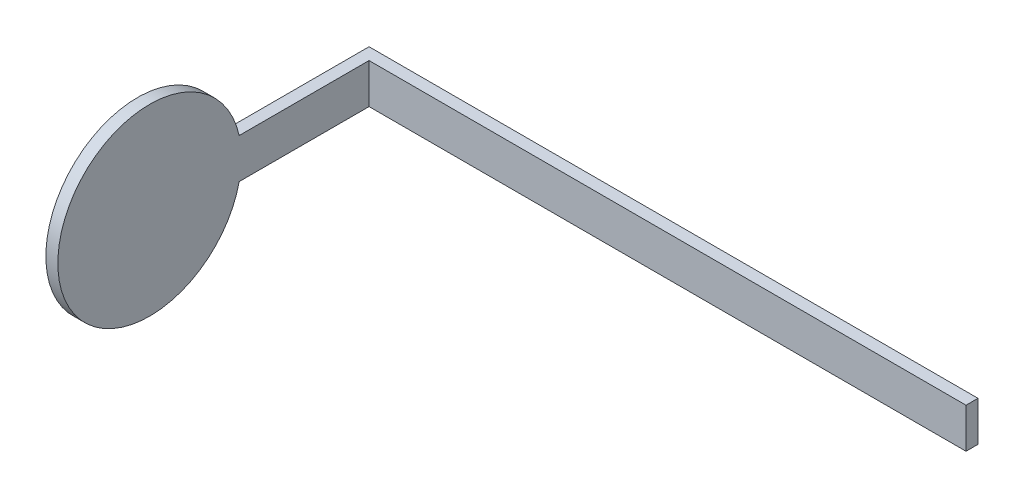
ISO-10303-21;
HEADER;
FILE_DESCRIPTION(('STEP AP214'),'2;1');
FILE_NAME('part.step','',(''),(''),'','','');
FILE_SCHEMA(('AUTOMOTIVE_DESIGN { 1 0 10303 214 1 1 1 1 }'));
ENDSEC;
DATA;
#1=APPLICATION_CONTEXT('core data for automotive mechanical design processes');
#2=APPLICATION_PROTOCOL_DEFINITION('international standard','automotive_design',2000,#1);
#3=PRODUCT_CONTEXT('',#1,'mechanical');
#4=PRODUCT('Part','Part','',(#3));
#5=PRODUCT_RELATED_PRODUCT_CATEGORY('part','',(#4));
#6=PRODUCT_DEFINITION_FORMATION('','',#4);
#7=PRODUCT_DEFINITION_CONTEXT('part definition',#1,'design');
#8=PRODUCT_DEFINITION('design','',#6,#7);
#9=PRODUCT_DEFINITION_SHAPE('','',#8);
#10=(LENGTH_UNIT() NAMED_UNIT(*) SI_UNIT(.MILLI.,.METRE.));
#11=(NAMED_UNIT(*) PLANE_ANGLE_UNIT() SI_UNIT($,.RADIAN.));
#12=(NAMED_UNIT(*) SI_UNIT($,.STERADIAN.) SOLID_ANGLE_UNIT());
#13=UNCERTAINTY_MEASURE_WITH_UNIT(LENGTH_MEASURE(1.E-05),#10,'distance_accuracy_value','');
#14=(GEOMETRIC_REPRESENTATION_CONTEXT(3) GLOBAL_UNCERTAINTY_ASSIGNED_CONTEXT((#13)) GLOBAL_UNIT_ASSIGNED_CONTEXT((#10,
#11,#12)) REPRESENTATION_CONTEXT('',''));
#15=CARTESIAN_POINT('',(0.,0.,0.));
#16=DIRECTION('',(0.,0.,1.));
#17=DIRECTION('',(1.,0.,0.));
#18=AXIS2_PLACEMENT_3D('',#15,#16,#17);
#19=CARTESIAN_POINT('',(-149.615,10.,0.));
#20=DIRECTION('',(0.,0.,-1.));
#21=DIRECTION('',(-1.,0.,0.));
#22=AXIS2_PLACEMENT_3D('',#19,#20,#21);
#23=PLANE('',#22);
#24=DIRECTION('',(1.,0.,0.));
#25=VECTOR('',#24,1.);
#26=CARTESIAN_POINT('',(-149.615,0.,0.));
#27=LINE('',#26,#25);
#28=CARTESIAN_POINT('',(-149.615,0.,0.));
#29=VERTEX_POINT('',#28);
#30=CARTESIAN_POINT('',(0.,0.,0.));
#31=VERTEX_POINT('',#30);
#32=EDGE_CURVE('E106',#29,#31,#27,.T.);
#33=ORIENTED_EDGE('',*,*,#32,.T.);
#34=DIRECTION('',(0.,-1.,0.));
#35=VECTOR('',#34,1.);
#36=CARTESIAN_POINT('',(0.,10.,0.));
#37=LINE('',#36,#35);
#38=CARTESIAN_POINT('',(0.,10.,0.));
#39=VERTEX_POINT('',#38);
#40=EDGE_CURVE('E46',#39,#31,#37,.T.);
#41=ORIENTED_EDGE('',*,*,#40,.F.);
#42=DIRECTION('',(1.,0.,0.));
#43=VECTOR('',#42,1.);
#44=CARTESIAN_POINT('',(-149.615,10.,0.));
#45=LINE('',#44,#43);
#46=CARTESIAN_POINT('',(-149.615,10.,0.));
#47=VERTEX_POINT('',#46);
#48=EDGE_CURVE('E127',#47,#39,#45,.T.);
#49=ORIENTED_EDGE('',*,*,#48,.F.);
#50=DIRECTION('',(0.,-1.,0.));
#51=VECTOR('',#50,1.);
#52=CARTESIAN_POINT('',(-149.615,10.,0.));
#53=LINE('',#52,#51);
#54=EDGE_CURVE('E109',#47,#29,#53,.T.);
#55=ORIENTED_EDGE('',*,*,#54,.T.);
#56=EDGE_LOOP('',(#33,#41,#49,#55));
#57=FACE_BOUND('',#56,.T.);
#58=ADVANCED_FACE('F39',(#57),#23,.F.);
#59=CARTESIAN_POINT('',(0.,10.,0.));
#60=DIRECTION('',(-1.,0.,0.));
#61=DIRECTION('',(0.,0.,1.));
#62=AXIS2_PLACEMENT_3D('',#59,#60,#61);
#63=PLANE('',#62);
#64=DIRECTION('',(0.,0.,-1.));
#65=VECTOR('',#64,1.);
#66=CARTESIAN_POINT('',(0.,0.,0.));
#67=LINE('',#66,#65);
#68=CARTESIAN_POINT('',(0.,0.,-3.));
#69=VERTEX_POINT('',#68);
#70=EDGE_CURVE('E120',#31,#69,#67,.T.);
#71=ORIENTED_EDGE('',*,*,#70,.T.);
#72=DIRECTION('',(0.,-1.,0.));
#73=VECTOR('',#72,1.);
#74=CARTESIAN_POINT('',(0.,10.,-3.));
#75=LINE('',#74,#73);
#76=CARTESIAN_POINT('',(0.,10.,-3.));
#77=VERTEX_POINT('',#76);
#78=EDGE_CURVE('E131',#77,#69,#75,.T.);
#79=ORIENTED_EDGE('',*,*,#78,.F.);
#80=DIRECTION('',(0.,0.,-1.));
#81=VECTOR('',#80,1.);
#82=CARTESIAN_POINT('',(0.,10.,0.));
#83=LINE('',#82,#81);
#84=EDGE_CURVE('E88',#39,#77,#83,.T.);
#85=ORIENTED_EDGE('',*,*,#84,.F.);
#86=ORIENTED_EDGE('',*,*,#40,.T.);
#87=EDGE_LOOP('',(#71,#79,#85,#86));
#88=FACE_BOUND('',#87,.T.);
#89=ADVANCED_FACE('F134',(#88),#63,.F.);
#90=CARTESIAN_POINT('',(0.,10.,-3.));
#91=DIRECTION('',(0.,0.,1.));
#92=DIRECTION('',(1.,0.,0.));
#93=AXIS2_PLACEMENT_3D('',#90,#91,#92);
#94=PLANE('',#93);
#95=DIRECTION('',(-1.,0.,0.));
#96=VECTOR('',#95,1.);
#97=CARTESIAN_POINT('',(0.,0.,-3.));
#98=LINE('',#97,#96);
#99=CARTESIAN_POINT('',(-152.615,0.,-3.));
#100=VERTEX_POINT('',#99);
#101=EDGE_CURVE('E122',#69,#100,#98,.T.);
#102=ORIENTED_EDGE('',*,*,#101,.T.);
#103=DIRECTION('',(0.,-1.,0.));
#104=VECTOR('',#103,1.);
#105=CARTESIAN_POINT('',(-152.615,10.,-3.));
#106=LINE('',#105,#104);
#107=CARTESIAN_POINT('',(-152.615,10.,-3.));
#108=VERTEX_POINT('',#107);
#109=EDGE_CURVE('E112',#108,#100,#106,.T.);
#110=ORIENTED_EDGE('',*,*,#109,.F.);
#111=DIRECTION('',(-1.,0.,0.));
#112=VECTOR('',#111,1.);
#113=CARTESIAN_POINT('',(0.,10.,-3.));
#114=LINE('',#113,#112);
#115=EDGE_CURVE('E114',#77,#108,#114,.T.);
#116=ORIENTED_EDGE('',*,*,#115,.F.);
#117=ORIENTED_EDGE('',*,*,#78,.T.);
#118=EDGE_LOOP('',(#102,#110,#116,#117));
#119=FACE_BOUND('',#118,.T.);
#120=ADVANCED_FACE('F143',(#119),#94,.F.);
#121=CARTESIAN_POINT('',(-152.615,10.,-3.));
#122=DIRECTION('',(1.,0.,0.));
#123=DIRECTION('',(0.,0.,-1.));
#124=AXIS2_PLACEMENT_3D('',#121,#122,#123);
#125=PLANE('',#124);
#126=DIRECTION('',(0.,0.,1.));
#127=VECTOR('',#126,1.);
#128=CARTESIAN_POINT('',(-152.615,0.,-3.));
#129=LINE('',#128,#127);
#130=CARTESIAN_POINT('',(-152.615,0.,32.5500556793563));
#131=VERTEX_POINT('',#130);
#132=EDGE_CURVE('E124',#100,#131,#129,.T.);
#133=ORIENTED_EDGE('',*,*,#132,.T.);
#134=CARTESIAN_POINT('',(-152.615,5.,55.));
#135=DIRECTION('',(1.,0.,0.));
#136=DIRECTION('',(0.,0.,-1.));
#137=AXIS2_PLACEMENT_3D('',#134,#135,#136);
#138=CIRCLE('',#137,23.);
#139=CARTESIAN_POINT('',(-152.615,10.,32.5500556793564));
#140=VERTEX_POINT('',#139);
#141=EDGE_CURVE('E100',#140,#131,#138,.T.);
#142=ORIENTED_EDGE('',*,*,#141,.F.);
#143=DIRECTION('',(0.,0.,1.));
#144=VECTOR('',#143,1.);
#145=CARTESIAN_POINT('',(-152.615,10.,-3.));
#146=LINE('',#145,#144);
#147=EDGE_CURVE('E105',#108,#140,#146,.T.);
#148=ORIENTED_EDGE('',*,*,#147,.F.);
#149=ORIENTED_EDGE('',*,*,#109,.T.);
#150=EDGE_LOOP('',(#133,#142,#148,#149));
#151=FACE_BOUND('',#150,.T.);
#152=ADVANCED_FACE('F146',(#151),#125,.F.);
#153=CARTESIAN_POINT('',(-149.615,10.,60.));
#154=DIRECTION('',(-1.,0.,0.));
#155=DIRECTION('',(0.,0.,1.));
#156=AXIS2_PLACEMENT_3D('',#153,#154,#155);
#157=PLANE('',#156);
#158=DIRECTION('',(0.,0.,-1.));
#159=VECTOR('',#158,1.);
#160=CARTESIAN_POINT('',(-149.615,10.,60.));
#161=LINE('',#160,#159);
#162=CARTESIAN_POINT('',(-149.615,10.,32.5500556793564));
#163=VERTEX_POINT('',#162);
#164=EDGE_CURVE('E61',#163,#47,#161,.T.);
#165=ORIENTED_EDGE('',*,*,#164,.F.);
#166=CARTESIAN_POINT('',(-149.615,5.,55.));
#167=DIRECTION('',(1.,0.,0.));
#168=DIRECTION('',(0.,0.,-1.));
#169=AXIS2_PLACEMENT_3D('',#166,#167,#168);
#170=CIRCLE('',#169,23.);
#171=CARTESIAN_POINT('',(-149.615,0.,32.5500556793563));
#172=VERTEX_POINT('',#171);
#173=EDGE_CURVE('E53',#163,#172,#170,.T.);
#174=ORIENTED_EDGE('',*,*,#173,.T.);
#175=DIRECTION('',(0.,0.,-1.));
#176=VECTOR('',#175,1.);
#177=CARTESIAN_POINT('',(-149.615,0.,60.));
#178=LINE('',#177,#176);
#179=EDGE_CURVE('E80',#172,#29,#178,.T.);
#180=ORIENTED_EDGE('',*,*,#179,.T.);
#181=ORIENTED_EDGE('',*,*,#54,.F.);
#182=EDGE_LOOP('',(#165,#174,#180,#181));
#183=FACE_BOUND('',#182,.T.);
#184=ADVANCED_FACE('F108',(#183),#157,.F.);
#185=CARTESIAN_POINT('',(0.,10.,0.));
#186=DIRECTION('',(0.,1.,0.));
#187=DIRECTION('',(0.,0.,1.));
#188=AXIS2_PLACEMENT_3D('',#185,#186,#187);
#189=PLANE('',#188);
#190=DIRECTION('',(1.,0.,0.));
#191=VECTOR('',#190,1.);
#192=CARTESIAN_POINT('',(-152.615,10.,32.5500556793564));
#193=LINE('',#192,#191);
#194=EDGE_CURVE('E98',#163,#140,#193,.F.);
#195=ORIENTED_EDGE('',*,*,#194,.F.);
#196=ORIENTED_EDGE('',*,*,#164,.T.);
#197=ORIENTED_EDGE('',*,*,#48,.T.);
#198=ORIENTED_EDGE('',*,*,#84,.T.);
#199=ORIENTED_EDGE('',*,*,#115,.T.);
#200=ORIENTED_EDGE('',*,*,#147,.T.);
#201=EDGE_LOOP('',(#195,#196,#197,#198,#199,#200));
#202=FACE_BOUND('',#201,.T.);
#203=ADVANCED_FACE('F103',(#202),#189,.T.);
#204=CARTESIAN_POINT('',(0.,0.,0.));
#205=DIRECTION('',(0.,1.,0.));
#206=DIRECTION('',(0.,0.,1.));
#207=AXIS2_PLACEMENT_3D('',#204,#205,#206);
#208=PLANE('',#207);
#209=ORIENTED_EDGE('',*,*,#179,.F.);
#210=DIRECTION('',(1.,0.,0.));
#211=VECTOR('',#210,1.);
#212=CARTESIAN_POINT('',(-152.615,0.,32.5500556793564));
#213=LINE('',#212,#211);
#214=EDGE_CURVE('E11',#172,#131,#213,.F.);
#215=ORIENTED_EDGE('',*,*,#214,.T.);
#216=ORIENTED_EDGE('',*,*,#132,.F.);
#217=ORIENTED_EDGE('',*,*,#101,.F.);
#218=ORIENTED_EDGE('',*,*,#70,.F.);
#219=ORIENTED_EDGE('',*,*,#32,.F.);
#220=EDGE_LOOP('',(#209,#215,#216,#217,#218,#219));
#221=FACE_BOUND('',#220,.T.);
#222=ADVANCED_FACE('F138',(#221),#208,.F.);
#223=CARTESIAN_POINT('',(-152.615,5.,55.));
#224=DIRECTION('',(1.,0.,0.));
#225=DIRECTION('',(0.,0.,-1.));
#226=AXIS2_PLACEMENT_3D('',#223,#224,#225);
#227=CYLINDRICAL_SURFACE('',#226,23.);
#228=ORIENTED_EDGE('',*,*,#173,.F.);
#229=ORIENTED_EDGE('',*,*,#194,.T.);
#230=ORIENTED_EDGE('',*,*,#141,.T.);
#231=ORIENTED_EDGE('',*,*,#214,.F.);
#232=EDGE_LOOP('',(#228,#229,#230,#231));
#233=FACE_BOUND('',#232,.T.);
#234=ADVANCED_FACE('F97',(#233),#227,.T.);
#235=CLOSED_SHELL('',(#58,#89,#120,#152,#184,#203,#222,#234));
#236=MANIFOLD_SOLID_BREP('B2',#235);
#237=ADVANCED_BREP_SHAPE_REPRESENTATION('',(#18,#236),#14);
#238=SHAPE_DEFINITION_REPRESENTATION(#9,#237);
ENDSEC;
END-ISO-10303-21;
